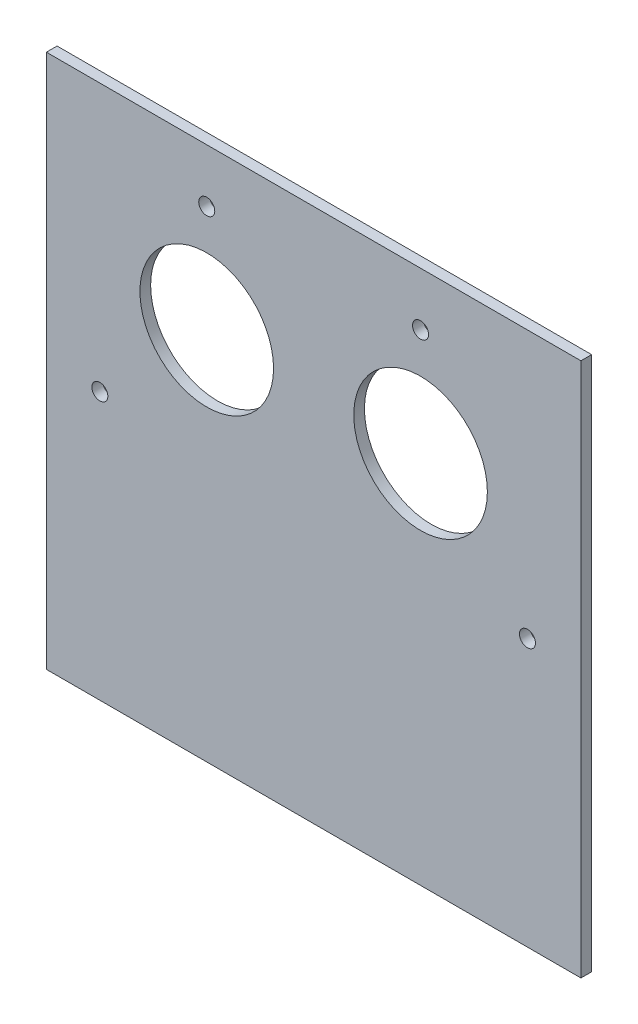
ISO-10303-21;
HEADER;
FILE_DESCRIPTION(('STEP AP214'),'2;1');
FILE_NAME('part.step','',(''),(''),'','','');
FILE_SCHEMA(('AUTOMOTIVE_DESIGN { 1 0 10303 214 1 1 1 1 }'));
ENDSEC;
DATA;
#1=APPLICATION_CONTEXT('core data for automotive mechanical design processes');
#2=APPLICATION_PROTOCOL_DEFINITION('international standard','automotive_design',2000,#1);
#3=PRODUCT_CONTEXT('',#1,'mechanical');
#4=PRODUCT('Part','Part','',(#3));
#5=PRODUCT_RELATED_PRODUCT_CATEGORY('part','',(#4));
#6=PRODUCT_DEFINITION_FORMATION('','',#4);
#7=PRODUCT_DEFINITION_CONTEXT('part definition',#1,'design');
#8=PRODUCT_DEFINITION('design','',#6,#7);
#9=PRODUCT_DEFINITION_SHAPE('','',#8);
#10=(LENGTH_UNIT() NAMED_UNIT(*) SI_UNIT(.MILLI.,.METRE.));
#11=(NAMED_UNIT(*) PLANE_ANGLE_UNIT() SI_UNIT($,.RADIAN.));
#12=(NAMED_UNIT(*) SI_UNIT($,.STERADIAN.) SOLID_ANGLE_UNIT());
#13=UNCERTAINTY_MEASURE_WITH_UNIT(LENGTH_MEASURE(1.E-05),#10,'distance_accuracy_value','');
#14=(GEOMETRIC_REPRESENTATION_CONTEXT(3) GLOBAL_UNCERTAINTY_ASSIGNED_CONTEXT((#13)) GLOBAL_UNIT_ASSIGNED_CONTEXT((#10,
#11,#12)) REPRESENTATION_CONTEXT('',''));
#15=CARTESIAN_POINT('',(0.,0.,0.));
#16=DIRECTION('',(0.,0.,1.));
#17=DIRECTION('',(1.,0.,0.));
#18=AXIS2_PLACEMENT_3D('',#15,#16,#17);
#19=CARTESIAN_POINT('',(50.,50.,2.));
#20=DIRECTION('',(0.,0.,-1.));
#21=DIRECTION('',(-1.,0.,0.));
#22=AXIS2_PLACEMENT_3D('',#19,#20,#21);
#23=PLANE('',#22);
#24=CARTESIAN_POINT('',(20.,20.,2.));
#25=DIRECTION('',(0.,0.,1.));
#26=DIRECTION('',(1.,0.,0.));
#27=AXIS2_PLACEMENT_3D('',#24,#25,#26);
#28=CIRCLE('',#27,12.5);
#29=CARTESIAN_POINT('',(32.5,20.,2.));
#30=VERTEX_POINT('',#29);
#31=EDGE_CURVE('E134',#30,#30,#28,.T.);
#32=ORIENTED_EDGE('',*,*,#31,.F.);
#33=EDGE_LOOP('',(#32));
#34=FACE_BOUND('',#33,.T.);
#35=CARTESIAN_POINT('',(-20.,20.,2.));
#36=DIRECTION('',(0.,0.,1.));
#37=DIRECTION('',(1.,0.,0.));
#38=AXIS2_PLACEMENT_3D('',#35,#36,#37);
#39=CIRCLE('',#38,12.5);
#40=CARTESIAN_POINT('',(-7.5,20.,2.));
#41=VERTEX_POINT('',#40);
#42=EDGE_CURVE('E124',#41,#41,#39,.T.);
#43=ORIENTED_EDGE('',*,*,#42,.F.);
#44=EDGE_LOOP('',(#43));
#45=FACE_BOUND('',#44,.T.);
#46=DIRECTION('',(0.,1.,0.));
#47=VECTOR('',#46,1.);
#48=CARTESIAN_POINT('',(50.,-50.,2.));
#49=LINE('',#48,#47);
#50=CARTESIAN_POINT('',(50.,-50.,2.));
#51=VERTEX_POINT('',#50);
#52=CARTESIAN_POINT('',(50.,50.,2.));
#53=VERTEX_POINT('',#52);
#54=EDGE_CURVE('E86',#51,#53,#49,.T.);
#55=ORIENTED_EDGE('',*,*,#54,.T.);
#56=DIRECTION('',(-1.,0.,0.));
#57=VECTOR('',#56,1.);
#58=CARTESIAN_POINT('',(-50.,50.,2.));
#59=LINE('',#58,#57);
#60=CARTESIAN_POINT('',(-50.,50.,2.));
#61=VERTEX_POINT('',#60);
#62=EDGE_CURVE('E81',#53,#61,#59,.T.);
#63=ORIENTED_EDGE('',*,*,#62,.T.);
#64=DIRECTION('',(0.,-1.,0.));
#65=VECTOR('',#64,1.);
#66=CARTESIAN_POINT('',(-50.,-50.,2.));
#67=LINE('',#66,#65);
#68=CARTESIAN_POINT('',(-50.,-50.,2.));
#69=VERTEX_POINT('',#68);
#70=EDGE_CURVE('E84',#61,#69,#67,.T.);
#71=ORIENTED_EDGE('',*,*,#70,.T.);
#72=DIRECTION('',(1.,0.,0.));
#73=VECTOR('',#72,1.);
#74=CARTESIAN_POINT('',(-50.,-50.,2.));
#75=LINE('',#74,#73);
#76=EDGE_CURVE('E51',#69,#51,#75,.T.);
#77=ORIENTED_EDGE('',*,*,#76,.T.);
#78=EDGE_LOOP('',(#55,#63,#71,#77));
#79=FACE_BOUND('',#78,.T.);
#80=CARTESIAN_POINT('',(-20.,40.,2.));
#81=DIRECTION('',(0.,0.,1.));
#82=DIRECTION('',(1.,0.,0.));
#83=AXIS2_PLACEMENT_3D('',#80,#81,#82);
#84=CIRCLE('',#83,1.5);
#85=CARTESIAN_POINT('',(-18.5,40.,2.));
#86=VERTEX_POINT('',#85);
#87=EDGE_CURVE('E110',#86,#86,#84,.T.);
#88=ORIENTED_EDGE('',*,*,#87,.F.);
#89=EDGE_LOOP('',(#88));
#90=FACE_BOUND('',#89,.T.);
#91=CARTESIAN_POINT('',(20.,40.,2.));
#92=DIRECTION('',(0.,0.,1.));
#93=DIRECTION('',(1.,0.,0.));
#94=AXIS2_PLACEMENT_3D('',#91,#92,#93);
#95=CIRCLE('',#94,1.5);
#96=CARTESIAN_POINT('',(21.5,40.,2.));
#97=VERTEX_POINT('',#96);
#98=EDGE_CURVE('E114',#97,#97,#95,.T.);
#99=ORIENTED_EDGE('',*,*,#98,.F.);
#100=EDGE_LOOP('',(#99));
#101=FACE_BOUND('',#100,.T.);
#102=CARTESIAN_POINT('',(-40.,0.,2.));
#103=DIRECTION('',(0.,0.,1.));
#104=DIRECTION('',(1.,0.,0.));
#105=AXIS2_PLACEMENT_3D('',#102,#103,#104);
#106=CIRCLE('',#105,1.5);
#107=CARTESIAN_POINT('',(-38.5,0.,2.));
#108=VERTEX_POINT('',#107);
#109=EDGE_CURVE('E118',#108,#108,#106,.T.);
#110=ORIENTED_EDGE('',*,*,#109,.F.);
#111=EDGE_LOOP('',(#110));
#112=FACE_BOUND('',#111,.T.);
#113=CARTESIAN_POINT('',(40.,0.,2.));
#114=DIRECTION('',(0.,0.,-1.));
#115=DIRECTION('',(-1.,0.,0.));
#116=AXIS2_PLACEMENT_3D('',#113,#114,#115);
#117=CIRCLE('',#116,1.5);
#118=CARTESIAN_POINT('',(38.5,0.,2.));
#119=VERTEX_POINT('',#118);
#120=EDGE_CURVE('E121',#119,#119,#117,.T.);
#121=ORIENTED_EDGE('',*,*,#120,.T.);
#122=EDGE_LOOP('',(#121));
#123=FACE_BOUND('',#122,.T.);
#124=ADVANCED_FACE('F32',(#34,#45,#79,#90,#101,#112,#123),#23,.F.);
#125=CARTESIAN_POINT('',(50.,50.,0.));
#126=DIRECTION('',(0.,0.,-1.));
#127=DIRECTION('',(-1.,0.,0.));
#128=AXIS2_PLACEMENT_3D('',#125,#126,#127);
#129=PLANE('',#128);
#130=CARTESIAN_POINT('',(20.,20.,0.));
#131=DIRECTION('',(0.,0.,-1.));
#132=DIRECTION('',(-1.,0.,0.));
#133=AXIS2_PLACEMENT_3D('',#130,#131,#132);
#134=CIRCLE('',#133,12.5);
#135=CARTESIAN_POINT('',(7.5,20.,0.));
#136=VERTEX_POINT('',#135);
#137=EDGE_CURVE('E36',#136,#136,#134,.T.);
#138=ORIENTED_EDGE('',*,*,#137,.F.);
#139=EDGE_LOOP('',(#138));
#140=FACE_BOUND('',#139,.T.);
#141=CARTESIAN_POINT('',(-20.,20.,0.));
#142=DIRECTION('',(0.,0.,-1.));
#143=DIRECTION('',(-1.,0.,0.));
#144=AXIS2_PLACEMENT_3D('',#141,#142,#143);
#145=CIRCLE('',#144,12.5);
#146=CARTESIAN_POINT('',(-32.5,20.,0.));
#147=VERTEX_POINT('',#146);
#148=EDGE_CURVE('E122',#147,#147,#145,.T.);
#149=ORIENTED_EDGE('',*,*,#148,.F.);
#150=EDGE_LOOP('',(#149));
#151=FACE_BOUND('',#150,.T.);
#152=DIRECTION('',(0.,1.,0.));
#153=VECTOR('',#152,1.);
#154=CARTESIAN_POINT('',(50.,-50.,0.));
#155=LINE('',#154,#153);
#156=CARTESIAN_POINT('',(50.,-50.,0.));
#157=VERTEX_POINT('',#156);
#158=CARTESIAN_POINT('',(50.,50.,0.));
#159=VERTEX_POINT('',#158);
#160=EDGE_CURVE('E99',#157,#159,#155,.T.);
#161=ORIENTED_EDGE('',*,*,#160,.F.);
#162=DIRECTION('',(1.,0.,0.));
#163=VECTOR('',#162,1.);
#164=CARTESIAN_POINT('',(-50.,-50.,0.));
#165=LINE('',#164,#163);
#166=CARTESIAN_POINT('',(-50.,-50.,0.));
#167=VERTEX_POINT('',#166);
#168=EDGE_CURVE('E74',#167,#157,#165,.T.);
#169=ORIENTED_EDGE('',*,*,#168,.F.);
#170=DIRECTION('',(0.,-1.,0.));
#171=VECTOR('',#170,1.);
#172=CARTESIAN_POINT('',(-50.,-50.,0.));
#173=LINE('',#172,#171);
#174=CARTESIAN_POINT('',(-50.,50.,0.));
#175=VERTEX_POINT('',#174);
#176=EDGE_CURVE('E68',#175,#167,#173,.T.);
#177=ORIENTED_EDGE('',*,*,#176,.F.);
#178=DIRECTION('',(-1.,0.,0.));
#179=VECTOR('',#178,1.);
#180=CARTESIAN_POINT('',(-50.,50.,0.));
#181=LINE('',#180,#179);
#182=EDGE_CURVE('E90',#159,#175,#181,.T.);
#183=ORIENTED_EDGE('',*,*,#182,.F.);
#184=EDGE_LOOP('',(#161,#169,#177,#183));
#185=FACE_BOUND('',#184,.T.);
#186=CARTESIAN_POINT('',(-20.,40.,0.));
#187=DIRECTION('',(0.,0.,-1.));
#188=DIRECTION('',(-1.,0.,0.));
#189=AXIS2_PLACEMENT_3D('',#186,#187,#188);
#190=CIRCLE('',#189,1.5);
#191=CARTESIAN_POINT('',(-21.5,40.,0.));
#192=VERTEX_POINT('',#191);
#193=EDGE_CURVE('E102',#192,#192,#190,.T.);
#194=ORIENTED_EDGE('',*,*,#193,.F.);
#195=EDGE_LOOP('',(#194));
#196=FACE_BOUND('',#195,.T.);
#197=CARTESIAN_POINT('',(20.,40.,0.));
#198=DIRECTION('',(0.,0.,-1.));
#199=DIRECTION('',(-1.,0.,0.));
#200=AXIS2_PLACEMENT_3D('',#197,#198,#199);
#201=CIRCLE('',#200,1.5);
#202=CARTESIAN_POINT('',(18.5,40.,0.));
#203=VERTEX_POINT('',#202);
#204=EDGE_CURVE('E111',#203,#203,#201,.T.);
#205=ORIENTED_EDGE('',*,*,#204,.F.);
#206=EDGE_LOOP('',(#205));
#207=FACE_BOUND('',#206,.T.);
#208=CARTESIAN_POINT('',(-40.,0.,0.));
#209=DIRECTION('',(0.,0.,-1.));
#210=DIRECTION('',(-1.,0.,0.));
#211=AXIS2_PLACEMENT_3D('',#208,#209,#210);
#212=CIRCLE('',#211,1.5);
#213=CARTESIAN_POINT('',(-41.5,0.,0.));
#214=VERTEX_POINT('',#213);
#215=EDGE_CURVE('E115',#214,#214,#212,.T.);
#216=ORIENTED_EDGE('',*,*,#215,.F.);
#217=EDGE_LOOP('',(#216));
#218=FACE_BOUND('',#217,.T.);
#219=CARTESIAN_POINT('',(40.,0.,0.));
#220=DIRECTION('',(0.,0.,-1.));
#221=DIRECTION('',(-1.,0.,0.));
#222=AXIS2_PLACEMENT_3D('',#219,#220,#221);
#223=CIRCLE('',#222,1.5);
#224=CARTESIAN_POINT('',(38.5,0.,0.));
#225=VERTEX_POINT('',#224);
#226=EDGE_CURVE('E119',#225,#225,#223,.F.);
#227=ORIENTED_EDGE('',*,*,#226,.T.);
#228=EDGE_LOOP('',(#227));
#229=FACE_BOUND('',#228,.T.);
#230=ADVANCED_FACE('F147',(#140,#151,#185,#196,#207,#218,#229),#129,.T.);
#231=CARTESIAN_POINT('',(50.,-50.,2.));
#232=DIRECTION('',(-1.,0.,0.));
#233=DIRECTION('',(0.,0.,1.));
#234=AXIS2_PLACEMENT_3D('',#231,#232,#233);
#235=PLANE('',#234);
#236=ORIENTED_EDGE('',*,*,#160,.T.);
#237=DIRECTION('',(0.,0.,-1.));
#238=VECTOR('',#237,1.);
#239=CARTESIAN_POINT('',(50.,50.,2.));
#240=LINE('',#239,#238);
#241=EDGE_CURVE('E11',#53,#159,#240,.T.);
#242=ORIENTED_EDGE('',*,*,#241,.F.);
#243=ORIENTED_EDGE('',*,*,#54,.F.);
#244=DIRECTION('',(0.,0.,-1.));
#245=VECTOR('',#244,1.);
#246=CARTESIAN_POINT('',(50.,-50.,2.));
#247=LINE('',#246,#245);
#248=EDGE_CURVE('E95',#51,#157,#247,.T.);
#249=ORIENTED_EDGE('',*,*,#248,.T.);
#250=EDGE_LOOP('',(#236,#242,#243,#249));
#251=FACE_BOUND('',#250,.T.);
#252=ADVANCED_FACE('F34',(#251),#235,.F.);
#253=CARTESIAN_POINT('',(-50.,50.,2.));
#254=DIRECTION('',(0.,-1.,0.));
#255=DIRECTION('',(0.,0.,-1.));
#256=AXIS2_PLACEMENT_3D('',#253,#254,#255);
#257=PLANE('',#256);
#258=ORIENTED_EDGE('',*,*,#182,.T.);
#259=DIRECTION('',(0.,0.,-1.));
#260=VECTOR('',#259,1.);
#261=CARTESIAN_POINT('',(-50.,50.,2.));
#262=LINE('',#261,#260);
#263=EDGE_CURVE('E42',#61,#175,#262,.T.);
#264=ORIENTED_EDGE('',*,*,#263,.F.);
#265=ORIENTED_EDGE('',*,*,#62,.F.);
#266=ORIENTED_EDGE('',*,*,#241,.T.);
#267=EDGE_LOOP('',(#258,#264,#265,#266));
#268=FACE_BOUND('',#267,.T.);
#269=ADVANCED_FACE('F89',(#268),#257,.F.);
#270=CARTESIAN_POINT('',(-50.,-50.,2.));
#271=DIRECTION('',(1.,0.,0.));
#272=DIRECTION('',(0.,0.,-1.));
#273=AXIS2_PLACEMENT_3D('',#270,#271,#272);
#274=PLANE('',#273);
#275=ORIENTED_EDGE('',*,*,#176,.T.);
#276=DIRECTION('',(0.,0.,-1.));
#277=VECTOR('',#276,1.);
#278=CARTESIAN_POINT('',(-50.,-50.,2.));
#279=LINE('',#278,#277);
#280=EDGE_CURVE('E91',#69,#167,#279,.T.);
#281=ORIENTED_EDGE('',*,*,#280,.F.);
#282=ORIENTED_EDGE('',*,*,#70,.F.);
#283=ORIENTED_EDGE('',*,*,#263,.T.);
#284=EDGE_LOOP('',(#275,#281,#282,#283));
#285=FACE_BOUND('',#284,.T.);
#286=ADVANCED_FACE('F93',(#285),#274,.F.);
#287=CARTESIAN_POINT('',(-50.,-50.,2.));
#288=DIRECTION('',(0.,1.,0.));
#289=DIRECTION('',(0.,0.,1.));
#290=AXIS2_PLACEMENT_3D('',#287,#288,#289);
#291=PLANE('',#290);
#292=ORIENTED_EDGE('',*,*,#168,.T.);
#293=ORIENTED_EDGE('',*,*,#248,.F.);
#294=ORIENTED_EDGE('',*,*,#76,.F.);
#295=ORIENTED_EDGE('',*,*,#280,.T.);
#296=EDGE_LOOP('',(#292,#293,#294,#295));
#297=FACE_BOUND('',#296,.T.);
#298=ADVANCED_FACE('F178',(#297),#291,.F.);
#299=CARTESIAN_POINT('',(-20.,40.,-8.));
#300=DIRECTION('',(0.,0.,1.));
#301=DIRECTION('',(1.,0.,0.));
#302=AXIS2_PLACEMENT_3D('',#299,#300,#301);
#303=CYLINDRICAL_SURFACE('',#302,1.5);
#304=ORIENTED_EDGE('',*,*,#193,.T.);
#305=EDGE_LOOP('',(#304));
#306=FACE_BOUND('',#305,.T.);
#307=ORIENTED_EDGE('',*,*,#87,.T.);
#308=EDGE_LOOP('',(#307));
#309=FACE_BOUND('',#308,.T.);
#310=ADVANCED_FACE('F144',(#306,#309),#303,.F.);
#311=CARTESIAN_POINT('',(20.,40.,-8.));
#312=DIRECTION('',(0.,0.,1.));
#313=DIRECTION('',(1.,0.,0.));
#314=AXIS2_PLACEMENT_3D('',#311,#312,#313);
#315=CYLINDRICAL_SURFACE('',#314,1.5);
#316=ORIENTED_EDGE('',*,*,#204,.T.);
#317=EDGE_LOOP('',(#316));
#318=FACE_BOUND('',#317,.T.);
#319=ORIENTED_EDGE('',*,*,#98,.T.);
#320=EDGE_LOOP('',(#319));
#321=FACE_BOUND('',#320,.T.);
#322=ADVANCED_FACE('F168',(#318,#321),#315,.F.);
#323=CARTESIAN_POINT('',(-40.,0.,-8.));
#324=DIRECTION('',(0.,0.,1.));
#325=DIRECTION('',(1.,0.,0.));
#326=AXIS2_PLACEMENT_3D('',#323,#324,#325);
#327=CYLINDRICAL_SURFACE('',#326,1.5);
#328=ORIENTED_EDGE('',*,*,#215,.T.);
#329=EDGE_LOOP('',(#328));
#330=FACE_BOUND('',#329,.T.);
#331=ORIENTED_EDGE('',*,*,#109,.T.);
#332=EDGE_LOOP('',(#331));
#333=FACE_BOUND('',#332,.T.);
#334=ADVANCED_FACE('F159',(#330,#333),#327,.F.);
#335=CARTESIAN_POINT('',(40.,0.,-8.));
#336=DIRECTION('',(0.,0.,1.));
#337=DIRECTION('',(1.,0.,0.));
#338=AXIS2_PLACEMENT_3D('',#335,#336,#337);
#339=CYLINDRICAL_SURFACE('',#338,1.5);
#340=ORIENTED_EDGE('',*,*,#226,.F.);
#341=EDGE_LOOP('',(#340));
#342=FACE_BOUND('',#341,.T.);
#343=ORIENTED_EDGE('',*,*,#120,.F.);
#344=EDGE_LOOP('',(#343));
#345=FACE_BOUND('',#344,.T.);
#346=ADVANCED_FACE('F156',(#342,#345),#339,.F.);
#347=CARTESIAN_POINT('',(-20.,20.,-2.));
#348=DIRECTION('',(0.,0.,1.));
#349=DIRECTION('',(1.,0.,0.));
#350=AXIS2_PLACEMENT_3D('',#347,#348,#349);
#351=CYLINDRICAL_SURFACE('',#350,12.5);
#352=ORIENTED_EDGE('',*,*,#148,.T.);
#353=EDGE_LOOP('',(#352));
#354=FACE_BOUND('',#353,.T.);
#355=ORIENTED_EDGE('',*,*,#42,.T.);
#356=EDGE_LOOP('',(#355));
#357=FACE_BOUND('',#356,.T.);
#358=ADVANCED_FACE('F158',(#354,#357),#351,.F.);
#359=CARTESIAN_POINT('',(20.,20.,-2.));
#360=DIRECTION('',(0.,0.,1.));
#361=DIRECTION('',(1.,0.,0.));
#362=AXIS2_PLACEMENT_3D('',#359,#360,#361);
#363=CYLINDRICAL_SURFACE('',#362,12.5);
#364=ORIENTED_EDGE('',*,*,#137,.T.);
#365=EDGE_LOOP('',(#364));
#366=FACE_BOUND('',#365,.T.);
#367=ORIENTED_EDGE('',*,*,#31,.T.);
#368=EDGE_LOOP('',(#367));
#369=FACE_BOUND('',#368,.T.);
#370=ADVANCED_FACE('F166',(#366,#369),#363,.F.);
#371=CLOSED_SHELL('',(#124,#230,#252,#269,#286,#298,#310,#322,#334,#346,#358,#370));
#372=MANIFOLD_SOLID_BREP('B2',#371);
#373=ADVANCED_BREP_SHAPE_REPRESENTATION('',(#18,#372),#14);
#374=SHAPE_DEFINITION_REPRESENTATION(#9,#373);
ENDSEC;
END-ISO-10303-21;
